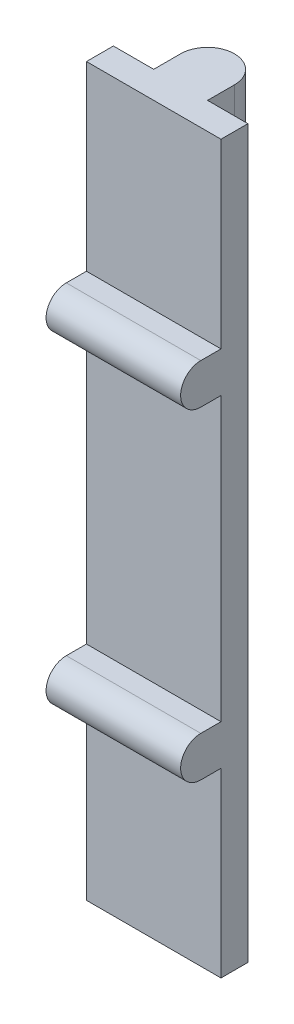
ISO-10303-21;
HEADER;
FILE_DESCRIPTION(('STEP AP214'),'2;1');
FILE_NAME('part.step','',(''),(''),'','','');
FILE_SCHEMA(('AUTOMOTIVE_DESIGN { 1 0 10303 214 1 1 1 1 }'));
ENDSEC;
DATA;
#1=APPLICATION_CONTEXT('core data for automotive mechanical design processes');
#2=APPLICATION_PROTOCOL_DEFINITION('international standard','automotive_design',2000,#1);
#3=PRODUCT_CONTEXT('',#1,'mechanical');
#4=PRODUCT('Part','Part','',(#3));
#5=PRODUCT_RELATED_PRODUCT_CATEGORY('part','',(#4));
#6=PRODUCT_DEFINITION_FORMATION('','',#4);
#7=PRODUCT_DEFINITION_CONTEXT('part definition',#1,'design');
#8=PRODUCT_DEFINITION('design','',#6,#7);
#9=PRODUCT_DEFINITION_SHAPE('','',#8);
#10=(LENGTH_UNIT() NAMED_UNIT(*) SI_UNIT(.MILLI.,.METRE.));
#11=(NAMED_UNIT(*) PLANE_ANGLE_UNIT() SI_UNIT($,.RADIAN.));
#12=(NAMED_UNIT(*) SI_UNIT($,.STERADIAN.) SOLID_ANGLE_UNIT());
#13=UNCERTAINTY_MEASURE_WITH_UNIT(LENGTH_MEASURE(1.E-05),#10,'distance_accuracy_value','');
#14=(GEOMETRIC_REPRESENTATION_CONTEXT(3) GLOBAL_UNCERTAINTY_ASSIGNED_CONTEXT((#13)) GLOBAL_UNIT_ASSIGNED_CONTEXT((#10,
#11,#12)) REPRESENTATION_CONTEXT('',''));
#15=CARTESIAN_POINT('',(0.,0.,0.));
#16=DIRECTION('',(0.,0.,1.));
#17=DIRECTION('',(1.,0.,0.));
#18=AXIS2_PLACEMENT_3D('',#15,#16,#17);
#19=CARTESIAN_POINT('',(0.,0.,0.));
#20=DIRECTION('',(0.,0.,1.));
#21=DIRECTION('',(1.,0.,0.));
#22=AXIS2_PLACEMENT_3D('',#19,#20,#21);
#23=PLANE('',#22);
#24=DIRECTION('',(0.,-1.,0.));
#25=VECTOR('',#24,1.);
#26=CARTESIAN_POINT('',(-38.1000000000001,757.642048968553,0.));
#27=LINE('',#26,#25);
#28=CARTESIAN_POINT('',(-38.1,685.8,0.));
#29=VERTEX_POINT('',#28);
#30=CARTESIAN_POINT('',(-38.1,0.,0.));
#31=VERTEX_POINT('',#30);
#32=EDGE_CURVE('E62',#29,#31,#27,.T.);
#33=ORIENTED_EDGE('',*,*,#32,.F.);
#34=DIRECTION('',(-1.,0.,0.));
#35=VECTOR('',#34,1.);
#36=CARTESIAN_POINT('',(0.,685.8,0.));
#37=LINE('',#36,#35);
#38=CARTESIAN_POINT('',(0.,685.8,0.));
#39=VERTEX_POINT('',#38);
#40=EDGE_CURVE('E252',#39,#29,#37,.T.);
#41=ORIENTED_EDGE('',*,*,#40,.F.);
#42=DIRECTION('',(0.,1.,0.));
#43=VECTOR('',#42,1.);
#44=CARTESIAN_POINT('',(0.,0.,0.));
#45=LINE('',#44,#43);
#46=CARTESIAN_POINT('',(0.,0.,0.));
#47=VERTEX_POINT('',#46);
#48=EDGE_CURVE('E213',#47,#39,#45,.T.);
#49=ORIENTED_EDGE('',*,*,#48,.F.);
#50=DIRECTION('',(1.,0.,0.));
#51=VECTOR('',#50,1.);
#52=CARTESIAN_POINT('',(0.,0.,0.));
#53=LINE('',#52,#51);
#54=EDGE_CURVE('E256',#31,#47,#53,.T.);
#55=ORIENTED_EDGE('',*,*,#54,.F.);
#56=EDGE_LOOP('',(#33,#41,#49,#55));
#57=FACE_BOUND('',#56,.T.);
#58=ADVANCED_FACE('F39',(#57),#23,.F.);
#59=CARTESIAN_POINT('',(0.,0.,25.4));
#60=DIRECTION('',(0.,0.,1.));
#61=DIRECTION('',(1.,0.,0.));
#62=AXIS2_PLACEMENT_3D('',#59,#60,#61);
#63=PLANE('',#62);
#64=DIRECTION('',(0.,1.,0.));
#65=VECTOR('',#64,1.);
#66=CARTESIAN_POINT('',(0.,0.,25.4));
#67=LINE('',#66,#65);
#68=CARTESIAN_POINT('',(0.,209.55,25.4));
#69=VERTEX_POINT('',#68);
#70=CARTESIAN_POINT('',(0.,476.25,25.4));
#71=VERTEX_POINT('',#70);
#72=EDGE_CURVE('E240',#69,#71,#67,.T.);
#73=ORIENTED_EDGE('',*,*,#72,.T.);
#74=DIRECTION('',(-1.,0.,0.));
#75=VECTOR('',#74,1.);
#76=CARTESIAN_POINT('',(53.8815367264149,476.25,25.4));
#77=LINE('',#76,#75);
#78=CARTESIAN_POINT('',(-127.,476.25,25.4));
#79=VERTEX_POINT('',#78);
#80=EDGE_CURVE('E206',#71,#79,#77,.T.);
#81=ORIENTED_EDGE('',*,*,#80,.T.);
#82=DIRECTION('',(0.,-1.,0.));
#83=VECTOR('',#82,1.);
#84=CARTESIAN_POINT('',(-127.,0.,25.4));
#85=LINE('',#84,#83);
#86=CARTESIAN_POINT('',(-127.,209.55,25.4));
#87=VERTEX_POINT('',#86);
#88=EDGE_CURVE('E247',#79,#87,#85,.T.);
#89=ORIENTED_EDGE('',*,*,#88,.T.);
#90=DIRECTION('',(-1.,0.,0.));
#91=VECTOR('',#90,1.);
#92=CARTESIAN_POINT('',(53.8815367264149,209.55,25.4));
#93=LINE('',#92,#91);
#94=EDGE_CURVE('E219',#69,#87,#93,.T.);
#95=ORIENTED_EDGE('',*,*,#94,.F.);
#96=EDGE_LOOP('',(#73,#81,#89,#95));
#97=FACE_BOUND('',#96,.T.);
#98=ADVANCED_FACE('F292',(#97),#63,.T.);
#99=CARTESIAN_POINT('',(0.,0.,25.4));
#100=VERTEX_POINT('',#99);
#101=CARTESIAN_POINT('',(0.,171.45,25.4));
#102=VERTEX_POINT('',#101);
#103=EDGE_CURVE('E237',#100,#102,#67,.T.);
#104=ORIENTED_EDGE('',*,*,#103,.T.);
#105=DIRECTION('',(-1.,0.,0.));
#106=VECTOR('',#105,1.);
#107=CARTESIAN_POINT('',(53.8815367264149,171.45,25.4));
#108=LINE('',#107,#106);
#109=CARTESIAN_POINT('',(-127.,171.45,25.4));
#110=VERTEX_POINT('',#109);
#111=EDGE_CURVE('E222',#102,#110,#108,.T.);
#112=ORIENTED_EDGE('',*,*,#111,.T.);
#113=CARTESIAN_POINT('',(-127.,0.,25.4));
#114=VERTEX_POINT('',#113);
#115=EDGE_CURVE('E243',#110,#114,#85,.T.);
#116=ORIENTED_EDGE('',*,*,#115,.T.);
#117=DIRECTION('',(1.,0.,0.));
#118=VECTOR('',#117,1.);
#119=CARTESIAN_POINT('',(0.,0.,25.4));
#120=LINE('',#119,#118);
#121=EDGE_CURVE('E246',#114,#100,#120,.T.);
#122=ORIENTED_EDGE('',*,*,#121,.T.);
#123=EDGE_LOOP('',(#104,#112,#116,#122));
#124=FACE_BOUND('',#123,.T.);
#125=ADVANCED_FACE('F286',(#124),#63,.T.);
#126=CARTESIAN_POINT('',(0.,0.,25.4));
#127=DIRECTION('',(-1.,0.,0.));
#128=DIRECTION('',(0.,0.,1.));
#129=AXIS2_PLACEMENT_3D('',#126,#127,#128);
#130=PLANE('',#129);
#131=ORIENTED_EDGE('',*,*,#48,.T.);
#132=DIRECTION('',(0.,0.,-1.));
#133=VECTOR('',#132,1.);
#134=CARTESIAN_POINT('',(0.,685.8,25.4));
#135=LINE('',#134,#133);
#136=CARTESIAN_POINT('',(0.,685.8,25.4));
#137=VERTEX_POINT('',#136);
#138=EDGE_CURVE('E11',#137,#39,#135,.T.);
#139=ORIENTED_EDGE('',*,*,#138,.F.);
#140=CARTESIAN_POINT('',(0.,514.35,25.4));
#141=VERTEX_POINT('',#140);
#142=EDGE_CURVE('E241',#141,#137,#67,.T.);
#143=ORIENTED_EDGE('',*,*,#142,.F.);
#144=DIRECTION('',(0.,0.,1.));
#145=VECTOR('',#144,1.);
#146=CARTESIAN_POINT('',(0.,514.35,44.45));
#147=LINE('',#146,#145);
#148=CARTESIAN_POINT('',(0.,514.35,44.45));
#149=VERTEX_POINT('',#148);
#150=EDGE_CURVE('E193',#141,#149,#147,.T.);
#151=ORIENTED_EDGE('',*,*,#150,.T.);
#152=CARTESIAN_POINT('',(0.,495.3,44.45));
#153=DIRECTION('',(-1.,0.,0.));
#154=DIRECTION('',(0.,0.,1.));
#155=AXIS2_PLACEMENT_3D('',#152,#153,#154);
#156=CIRCLE('',#155,19.05);
#157=CARTESIAN_POINT('',(0.,476.25,44.45));
#158=VERTEX_POINT('',#157);
#159=EDGE_CURVE('E190',#149,#158,#156,.F.);
#160=ORIENTED_EDGE('',*,*,#159,.T.);
#161=DIRECTION('',(0.,0.,-1.));
#162=VECTOR('',#161,1.);
#163=CARTESIAN_POINT('',(0.,476.25,44.45));
#164=LINE('',#163,#162);
#165=EDGE_CURVE('E187',#158,#71,#164,.T.);
#166=ORIENTED_EDGE('',*,*,#165,.T.);
#167=ORIENTED_EDGE('',*,*,#72,.F.);
#168=DIRECTION('',(0.,0.,1.));
#169=VECTOR('',#168,1.);
#170=CARTESIAN_POINT('',(0.,209.55,44.45));
#171=LINE('',#170,#169);
#172=CARTESIAN_POINT('',(0.,209.55,44.45));
#173=VERTEX_POINT('',#172);
#174=EDGE_CURVE('E186',#69,#173,#171,.T.);
#175=ORIENTED_EDGE('',*,*,#174,.T.);
#176=CARTESIAN_POINT('',(0.,190.5,44.45));
#177=DIRECTION('',(-1.,0.,0.));
#178=DIRECTION('',(0.,0.,1.));
#179=AXIS2_PLACEMENT_3D('',#176,#177,#178);
#180=CIRCLE('',#179,19.05);
#181=CARTESIAN_POINT('',(0.,171.45,44.45));
#182=VERTEX_POINT('',#181);
#183=EDGE_CURVE('E215',#173,#182,#180,.F.);
#184=ORIENTED_EDGE('',*,*,#183,.T.);
#185=DIRECTION('',(0.,0.,-1.));
#186=VECTOR('',#185,1.);
#187=CARTESIAN_POINT('',(0.,171.45,44.45));
#188=LINE('',#187,#186);
#189=EDGE_CURVE('E226',#182,#102,#188,.T.);
#190=ORIENTED_EDGE('',*,*,#189,.T.);
#191=ORIENTED_EDGE('',*,*,#103,.F.);
#192=DIRECTION('',(0.,0.,-1.));
#193=VECTOR('',#192,1.);
#194=CARTESIAN_POINT('',(0.,0.,25.4));
#195=LINE('',#194,#193);
#196=EDGE_CURVE('E249',#100,#47,#195,.T.);
#197=ORIENTED_EDGE('',*,*,#196,.T.);
#198=EDGE_LOOP('',(#131,#139,#143,#151,#160,#166,#167,#175,#184,#190,#191,#197));
#199=FACE_BOUND('',#198,.T.);
#200=ADVANCED_FACE('F41',(#199),#130,.F.);
#201=CARTESIAN_POINT('',(0.,685.8,25.4));
#202=DIRECTION('',(0.,-1.,0.));
#203=DIRECTION('',(0.,0.,-1.));
#204=AXIS2_PLACEMENT_3D('',#201,#202,#203);
#205=PLANE('',#204);
#206=ORIENTED_EDGE('',*,*,#40,.T.);
#207=DIRECTION('',(0.,0.,-1.));
#208=VECTOR('',#207,1.);
#209=CARTESIAN_POINT('',(-38.1000000000001,685.8,-25.4));
#210=LINE('',#209,#208);
#211=CARTESIAN_POINT('',(-38.1000000000001,685.8,-25.4));
#212=VERTEX_POINT('',#211);
#213=EDGE_CURVE('E184',#29,#212,#210,.T.);
#214=ORIENTED_EDGE('',*,*,#213,.T.);
#215=CARTESIAN_POINT('',(-63.5000000000001,685.8,-25.4));
#216=DIRECTION('',(0.,-1.,0.));
#217=DIRECTION('',(0.,0.,-1.));
#218=AXIS2_PLACEMENT_3D('',#215,#216,#217);
#219=CIRCLE('',#218,25.4);
#220=CARTESIAN_POINT('',(-88.9000000000001,685.8,-25.4));
#221=VERTEX_POINT('',#220);
#222=EDGE_CURVE('E160',#212,#221,#219,.F.);
#223=ORIENTED_EDGE('',*,*,#222,.T.);
#224=DIRECTION('',(0.,0.,1.));
#225=VECTOR('',#224,1.);
#226=CARTESIAN_POINT('',(-88.9000000000001,685.8,-25.4));
#227=LINE('',#226,#225);
#228=CARTESIAN_POINT('',(-88.9000000000001,685.8,0.));
#229=VERTEX_POINT('',#228);
#230=EDGE_CURVE('E180',#221,#229,#227,.T.);
#231=ORIENTED_EDGE('',*,*,#230,.T.);
#232=CARTESIAN_POINT('',(-127.,685.8,0.));
#233=VERTEX_POINT('',#232);
#234=EDGE_CURVE('E54',#229,#233,#37,.T.);
#235=ORIENTED_EDGE('',*,*,#234,.T.);
#236=DIRECTION('',(0.,0.,-1.));
#237=VECTOR('',#236,1.);
#238=CARTESIAN_POINT('',(-127.,685.8,25.4));
#239=LINE('',#238,#237);
#240=CARTESIAN_POINT('',(-127.,685.8,25.4));
#241=VERTEX_POINT('',#240);
#242=EDGE_CURVE('E47',#241,#233,#239,.T.);
#243=ORIENTED_EDGE('',*,*,#242,.F.);
#244=DIRECTION('',(-1.,0.,0.));
#245=VECTOR('',#244,1.);
#246=CARTESIAN_POINT('',(0.,685.8,25.4));
#247=LINE('',#246,#245);
#248=EDGE_CURVE('E239',#137,#241,#247,.T.);
#249=ORIENTED_EDGE('',*,*,#248,.F.);
#250=ORIENTED_EDGE('',*,*,#138,.T.);
#251=EDGE_LOOP('',(#206,#214,#223,#231,#235,#243,#249,#250));
#252=FACE_BOUND('',#251,.T.);
#253=ADVANCED_FACE('F278',(#252),#205,.F.);
#254=CARTESIAN_POINT('',(-127.,0.,25.4));
#255=DIRECTION('',(1.,0.,0.));
#256=DIRECTION('',(0.,0.,-1.));
#257=AXIS2_PLACEMENT_3D('',#254,#255,#256);
#258=PLANE('',#257);
#259=DIRECTION('',(0.,-1.,0.));
#260=VECTOR('',#259,1.);
#261=CARTESIAN_POINT('',(-127.,0.,0.));
#262=LINE('',#261,#260);
#263=CARTESIAN_POINT('',(-127.,0.,0.));
#264=VERTEX_POINT('',#263);
#265=EDGE_CURVE('E254',#233,#264,#262,.T.);
#266=ORIENTED_EDGE('',*,*,#265,.T.);
#267=DIRECTION('',(0.,0.,-1.));
#268=VECTOR('',#267,1.);
#269=CARTESIAN_POINT('',(-127.,0.,25.4));
#270=LINE('',#269,#268);
#271=EDGE_CURVE('E261',#114,#264,#270,.T.);
#272=ORIENTED_EDGE('',*,*,#271,.F.);
#273=ORIENTED_EDGE('',*,*,#115,.F.);
#274=DIRECTION('',(0.,0.,1.));
#275=VECTOR('',#274,1.);
#276=CARTESIAN_POINT('',(-127.,171.45,44.45));
#277=LINE('',#276,#275);
#278=CARTESIAN_POINT('',(-127.,171.45,44.45));
#279=VERTEX_POINT('',#278);
#280=EDGE_CURVE('E218',#110,#279,#277,.T.);
#281=ORIENTED_EDGE('',*,*,#280,.T.);
#282=CARTESIAN_POINT('',(-127.,190.5,44.45));
#283=DIRECTION('',(-1.,0.,0.));
#284=DIRECTION('',(0.,0.,1.));
#285=AXIS2_PLACEMENT_3D('',#282,#283,#284);
#286=CIRCLE('',#285,19.05);
#287=CARTESIAN_POINT('',(-127.,209.55,44.45));
#288=VERTEX_POINT('',#287);
#289=EDGE_CURVE('E198',#279,#288,#286,.T.);
#290=ORIENTED_EDGE('',*,*,#289,.T.);
#291=DIRECTION('',(0.,0.,-1.));
#292=VECTOR('',#291,1.);
#293=CARTESIAN_POINT('',(-127.,209.55,44.45));
#294=LINE('',#293,#292);
#295=EDGE_CURVE('E229',#288,#87,#294,.T.);
#296=ORIENTED_EDGE('',*,*,#295,.T.);
#297=ORIENTED_EDGE('',*,*,#88,.F.);
#298=DIRECTION('',(0.,0.,1.));
#299=VECTOR('',#298,1.);
#300=CARTESIAN_POINT('',(-127.,476.25,44.45));
#301=LINE('',#300,#299);
#302=CARTESIAN_POINT('',(-127.,476.25,44.45));
#303=VERTEX_POINT('',#302);
#304=EDGE_CURVE('E201',#79,#303,#301,.T.);
#305=ORIENTED_EDGE('',*,*,#304,.T.);
#306=CARTESIAN_POINT('',(-127.,495.3,44.45));
#307=DIRECTION('',(-1.,0.,0.));
#308=DIRECTION('',(0.,0.,1.));
#309=AXIS2_PLACEMENT_3D('',#306,#307,#308);
#310=CIRCLE('',#309,19.05);
#311=CARTESIAN_POINT('',(-127.,514.35,44.45));
#312=VERTEX_POINT('',#311);
#313=EDGE_CURVE('E194',#303,#312,#310,.T.);
#314=ORIENTED_EDGE('',*,*,#313,.T.);
#315=DIRECTION('',(0.,0.,-1.));
#316=VECTOR('',#315,1.);
#317=CARTESIAN_POINT('',(-127.,514.35,44.45));
#318=LINE('',#317,#316);
#319=CARTESIAN_POINT('',(-127.,514.35,25.4));
#320=VERTEX_POINT('',#319);
#321=EDGE_CURVE('E197',#312,#320,#318,.T.);
#322=ORIENTED_EDGE('',*,*,#321,.T.);
#323=EDGE_CURVE('E244',#241,#320,#85,.T.);
#324=ORIENTED_EDGE('',*,*,#323,.F.);
#325=ORIENTED_EDGE('',*,*,#242,.T.);
#326=EDGE_LOOP('',(#266,#272,#273,#281,#290,#296,#297,#305,#314,#322,#324,#325));
#327=FACE_BOUND('',#326,.T.);
#328=ADVANCED_FACE('F267',(#327),#258,.F.);
#329=CARTESIAN_POINT('',(0.,0.,25.4));
#330=DIRECTION('',(0.,1.,0.));
#331=DIRECTION('',(-1.,0.,0.));
#332=AXIS2_PLACEMENT_3D('',#329,#330,#331);
#333=PLANE('',#332);
#334=CARTESIAN_POINT('',(-88.9000000000001,0.,0.));
#335=VERTEX_POINT('',#334);
#336=EDGE_CURVE('E257',#264,#335,#53,.T.);
#337=ORIENTED_EDGE('',*,*,#336,.T.);
#338=DIRECTION('',(0.,0.,-1.));
#339=VECTOR('',#338,1.);
#340=CARTESIAN_POINT('',(-88.9,0.,-25.4));
#341=LINE('',#340,#339);
#342=CARTESIAN_POINT('',(-88.9,0.,-25.4));
#343=VERTEX_POINT('',#342);
#344=EDGE_CURVE('E163',#335,#343,#341,.T.);
#345=ORIENTED_EDGE('',*,*,#344,.T.);
#346=CARTESIAN_POINT('',(-63.5,0.,-25.4));
#347=DIRECTION('',(0.,-1.,0.));
#348=DIRECTION('',(1.,0.,0.));
#349=AXIS2_PLACEMENT_3D('',#346,#347,#348);
#350=CIRCLE('',#349,25.4);
#351=CARTESIAN_POINT('',(-38.1,0.,-25.4));
#352=VERTEX_POINT('',#351);
#353=EDGE_CURVE('E158',#343,#352,#350,.T.);
#354=ORIENTED_EDGE('',*,*,#353,.T.);
#355=DIRECTION('',(0.,0.,1.));
#356=VECTOR('',#355,1.);
#357=CARTESIAN_POINT('',(-38.1,0.,-25.4));
#358=LINE('',#357,#356);
#359=EDGE_CURVE('E166',#352,#31,#358,.T.);
#360=ORIENTED_EDGE('',*,*,#359,.T.);
#361=ORIENTED_EDGE('',*,*,#54,.T.);
#362=ORIENTED_EDGE('',*,*,#196,.F.);
#363=ORIENTED_EDGE('',*,*,#121,.F.);
#364=ORIENTED_EDGE('',*,*,#271,.T.);
#365=EDGE_LOOP('',(#337,#345,#354,#360,#361,#362,#363,#364));
#366=FACE_BOUND('',#365,.T.);
#367=ADVANCED_FACE('F171',(#366),#333,.F.);
#368=DIRECTION('',(-1.,0.,0.));
#369=VECTOR('',#368,1.);
#370=CARTESIAN_POINT('',(53.8815367264149,514.35,25.4));
#371=LINE('',#370,#369);
#372=EDGE_CURVE('E208',#141,#320,#371,.T.);
#373=ORIENTED_EDGE('',*,*,#372,.F.);
#374=ORIENTED_EDGE('',*,*,#142,.T.);
#375=ORIENTED_EDGE('',*,*,#248,.T.);
#376=ORIENTED_EDGE('',*,*,#323,.T.);
#377=EDGE_LOOP('',(#373,#374,#375,#376));
#378=FACE_BOUND('',#377,.T.);
#379=ADVANCED_FACE('F326',(#378),#63,.T.);
#380=ORIENTED_EDGE('',*,*,#234,.F.);
#381=DIRECTION('',(0.,-1.,0.));
#382=VECTOR('',#381,1.);
#383=CARTESIAN_POINT('',(-88.9000000000001,757.642048968553,0.));
#384=LINE('',#383,#382);
#385=EDGE_CURVE('E181',#229,#335,#384,.T.);
#386=ORIENTED_EDGE('',*,*,#385,.T.);
#387=ORIENTED_EDGE('',*,*,#336,.F.);
#388=ORIENTED_EDGE('',*,*,#265,.F.);
#389=EDGE_LOOP('',(#380,#386,#387,#388));
#390=FACE_BOUND('',#389,.T.);
#391=ADVANCED_FACE('F272',(#390),#23,.F.);
#392=CARTESIAN_POINT('',(53.8815367264149,190.5,44.45));
#393=DIRECTION('',(-1.,0.,0.));
#394=DIRECTION('',(0.,0.,1.));
#395=AXIS2_PLACEMENT_3D('',#392,#393,#394);
#396=CYLINDRICAL_SURFACE('',#395,19.05);
#397=ORIENTED_EDGE('',*,*,#183,.F.);
#398=DIRECTION('',(-1.,0.,0.));
#399=VECTOR('',#398,1.);
#400=CARTESIAN_POINT('',(53.8815367264149,209.55,44.45));
#401=LINE('',#400,#399);
#402=EDGE_CURVE('E216',#173,#288,#401,.T.);
#403=ORIENTED_EDGE('',*,*,#402,.T.);
#404=ORIENTED_EDGE('',*,*,#289,.F.);
#405=DIRECTION('',(-1.,0.,0.));
#406=VECTOR('',#405,1.);
#407=CARTESIAN_POINT('',(53.8815367264149,171.45,44.45));
#408=LINE('',#407,#406);
#409=EDGE_CURVE('E224',#182,#279,#408,.T.);
#410=ORIENTED_EDGE('',*,*,#409,.F.);
#411=EDGE_LOOP('',(#397,#403,#404,#410));
#412=FACE_BOUND('',#411,.T.);
#413=ADVANCED_FACE('F305',(#412),#396,.T.);
#414=CARTESIAN_POINT('',(53.8815367264149,171.45,44.45));
#415=DIRECTION('',(0.,-1.,0.));
#416=DIRECTION('',(0.,0.,-1.));
#417=AXIS2_PLACEMENT_3D('',#414,#415,#416);
#418=PLANE('',#417);
#419=ORIENTED_EDGE('',*,*,#189,.F.);
#420=ORIENTED_EDGE('',*,*,#409,.T.);
#421=ORIENTED_EDGE('',*,*,#280,.F.);
#422=ORIENTED_EDGE('',*,*,#111,.F.);
#423=EDGE_LOOP('',(#419,#420,#421,#422));
#424=FACE_BOUND('',#423,.T.);
#425=ADVANCED_FACE('F308',(#424),#418,.T.);
#426=CARTESIAN_POINT('',(53.8815367264149,209.55,44.45));
#427=DIRECTION('',(0.,1.,0.));
#428=DIRECTION('',(0.,0.,1.));
#429=AXIS2_PLACEMENT_3D('',#426,#427,#428);
#430=PLANE('',#429);
#431=ORIENTED_EDGE('',*,*,#174,.F.);
#432=ORIENTED_EDGE('',*,*,#94,.T.);
#433=ORIENTED_EDGE('',*,*,#295,.F.);
#434=ORIENTED_EDGE('',*,*,#402,.F.);
#435=EDGE_LOOP('',(#431,#432,#433,#434));
#436=FACE_BOUND('',#435,.T.);
#437=ADVANCED_FACE('F299',(#436),#430,.T.);
#438=CARTESIAN_POINT('',(53.8815367264149,495.3,44.45));
#439=DIRECTION('',(-1.,0.,0.));
#440=DIRECTION('',(0.,0.,1.));
#441=AXIS2_PLACEMENT_3D('',#438,#439,#440);
#442=CYLINDRICAL_SURFACE('',#441,19.05);
#443=ORIENTED_EDGE('',*,*,#159,.F.);
#444=DIRECTION('',(-1.,0.,0.));
#445=VECTOR('',#444,1.);
#446=CARTESIAN_POINT('',(53.8815367264149,514.35,44.45));
#447=LINE('',#446,#445);
#448=EDGE_CURVE('E204',#149,#312,#447,.T.);
#449=ORIENTED_EDGE('',*,*,#448,.T.);
#450=ORIENTED_EDGE('',*,*,#313,.F.);
#451=DIRECTION('',(-1.,0.,0.));
#452=VECTOR('',#451,1.);
#453=CARTESIAN_POINT('',(53.8815367264149,476.25,44.45));
#454=LINE('',#453,#452);
#455=EDGE_CURVE('E191',#158,#303,#454,.T.);
#456=ORIENTED_EDGE('',*,*,#455,.F.);
#457=EDGE_LOOP('',(#443,#449,#450,#456));
#458=FACE_BOUND('',#457,.T.);
#459=ADVANCED_FACE('F315',(#458),#442,.T.);
#460=CARTESIAN_POINT('',(53.8815367264149,476.25,44.45));
#461=DIRECTION('',(0.,-1.,0.));
#462=DIRECTION('',(0.,0.,-1.));
#463=AXIS2_PLACEMENT_3D('',#460,#461,#462);
#464=PLANE('',#463);
#465=ORIENTED_EDGE('',*,*,#165,.F.);
#466=ORIENTED_EDGE('',*,*,#455,.T.);
#467=ORIENTED_EDGE('',*,*,#304,.F.);
#468=ORIENTED_EDGE('',*,*,#80,.F.);
#469=EDGE_LOOP('',(#465,#466,#467,#468));
#470=FACE_BOUND('',#469,.T.);
#471=ADVANCED_FACE('F378',(#470),#464,.T.);
#472=CARTESIAN_POINT('',(53.8815367264149,514.35,44.45));
#473=DIRECTION('',(0.,1.,0.));
#474=DIRECTION('',(0.,0.,1.));
#475=AXIS2_PLACEMENT_3D('',#472,#473,#474);
#476=PLANE('',#475);
#477=ORIENTED_EDGE('',*,*,#150,.F.);
#478=ORIENTED_EDGE('',*,*,#372,.T.);
#479=ORIENTED_EDGE('',*,*,#321,.F.);
#480=ORIENTED_EDGE('',*,*,#448,.F.);
#481=EDGE_LOOP('',(#477,#478,#479,#480));
#482=FACE_BOUND('',#481,.T.);
#483=ADVANCED_FACE('F388',(#482),#476,.T.);
#484=CARTESIAN_POINT('',(-63.5000000000001,757.642048968553,-25.4));
#485=DIRECTION('',(0.,-1.,0.));
#486=DIRECTION('',(1.,0.,0.));
#487=AXIS2_PLACEMENT_3D('',#484,#485,#486);
#488=CYLINDRICAL_SURFACE('',#487,25.4);
#489=ORIENTED_EDGE('',*,*,#222,.F.);
#490=DIRECTION('',(0.,-1.,0.));
#491=VECTOR('',#490,1.);
#492=CARTESIAN_POINT('',(-38.1000000000001,757.642048968553,-25.4));
#493=LINE('',#492,#491);
#494=EDGE_CURVE('E153',#212,#352,#493,.T.);
#495=ORIENTED_EDGE('',*,*,#494,.T.);
#496=ORIENTED_EDGE('',*,*,#353,.F.);
#497=DIRECTION('',(0.,-1.,0.));
#498=VECTOR('',#497,1.);
#499=CARTESIAN_POINT('',(-88.9000000000001,757.642048968553,-25.4));
#500=LINE('',#499,#498);
#501=EDGE_CURVE('E178',#221,#343,#500,.T.);
#502=ORIENTED_EDGE('',*,*,#501,.F.);
#503=EDGE_LOOP('',(#489,#495,#496,#502));
#504=FACE_BOUND('',#503,.T.);
#505=ADVANCED_FACE('F155',(#504),#488,.T.);
#506=CARTESIAN_POINT('',(-88.9000000000001,757.642048968553,-25.4));
#507=DIRECTION('',(-1.,0.,0.));
#508=DIRECTION('',(0.,0.,1.));
#509=AXIS2_PLACEMENT_3D('',#506,#507,#508);
#510=PLANE('',#509);
#511=ORIENTED_EDGE('',*,*,#230,.F.);
#512=ORIENTED_EDGE('',*,*,#501,.T.);
#513=ORIENTED_EDGE('',*,*,#344,.F.);
#514=ORIENTED_EDGE('',*,*,#385,.F.);
#515=EDGE_LOOP('',(#511,#512,#513,#514));
#516=FACE_BOUND('',#515,.T.);
#517=ADVANCED_FACE('F277',(#516),#510,.T.);
#518=CARTESIAN_POINT('',(-38.1000000000001,757.642048968553,-25.4));
#519=DIRECTION('',(1.,0.,0.));
#520=DIRECTION('',(0.,0.,-1.));
#521=AXIS2_PLACEMENT_3D('',#518,#519,#520);
#522=PLANE('',#521);
#523=ORIENTED_EDGE('',*,*,#213,.F.);
#524=ORIENTED_EDGE('',*,*,#32,.T.);
#525=ORIENTED_EDGE('',*,*,#359,.F.);
#526=ORIENTED_EDGE('',*,*,#494,.F.);
#527=EDGE_LOOP('',(#523,#524,#525,#526));
#528=FACE_BOUND('',#527,.T.);
#529=ADVANCED_FACE('F167',(#528),#522,.T.);
#530=CLOSED_SHELL('',(#58,#98,#125,#200,#253,#328,#367,#379,#391,#413,#425,#437,#459,#471,#483,
#505,#517,#529));
#531=MANIFOLD_SOLID_BREP('B2',#530);
#532=ADVANCED_BREP_SHAPE_REPRESENTATION('',(#18,#531),#14);
#533=SHAPE_DEFINITION_REPRESENTATION(#9,#532);
ENDSEC;
END-ISO-10303-21;
